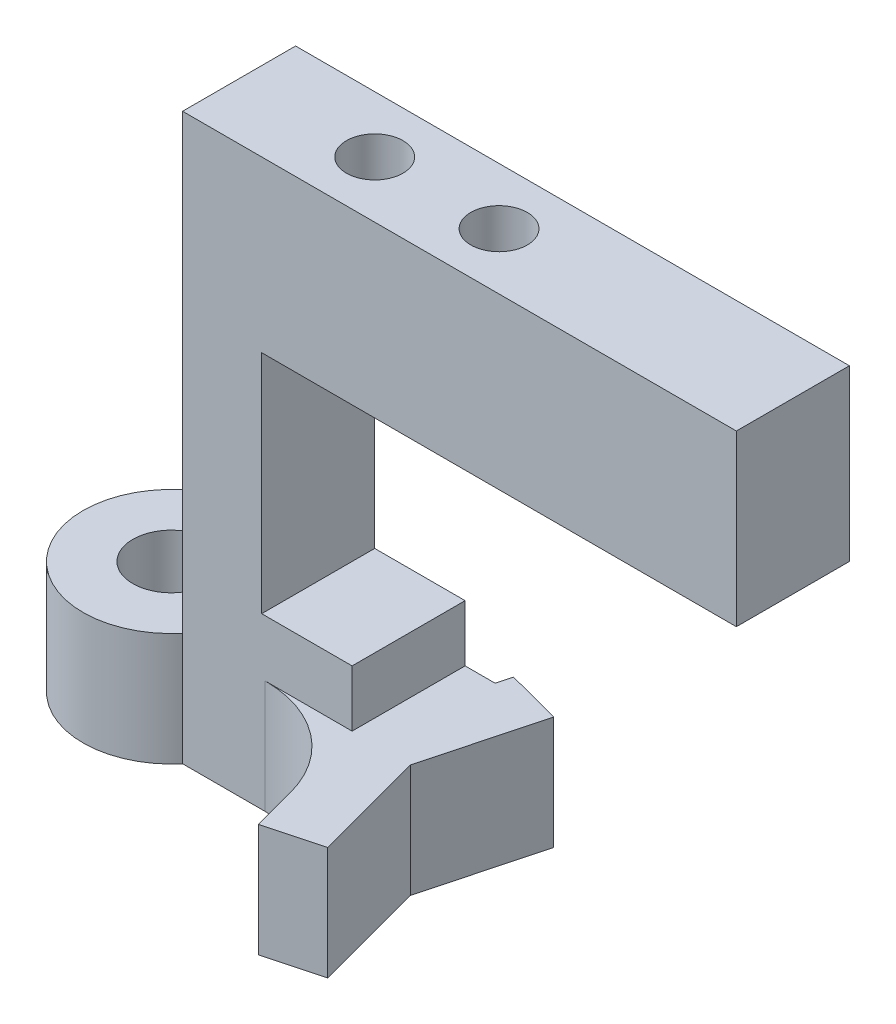
ISO-10303-21;
HEADER;
FILE_DESCRIPTION(('STEP AP214'),'2;1');
FILE_NAME('part.step','',(''),(''),'','','');
FILE_SCHEMA(('AUTOMOTIVE_DESIGN { 1 0 10303 214 1 1 1 1 }'));
ENDSEC;
DATA;
#1=APPLICATION_CONTEXT('core data for automotive mechanical design processes');
#2=APPLICATION_PROTOCOL_DEFINITION('international standard','automotive_design',2000,#1);
#3=PRODUCT_CONTEXT('',#1,'mechanical');
#4=PRODUCT('Part','Part','',(#3));
#5=PRODUCT_RELATED_PRODUCT_CATEGORY('part','',(#4));
#6=PRODUCT_DEFINITION_FORMATION('','',#4);
#7=PRODUCT_DEFINITION_CONTEXT('part definition',#1,'design');
#8=PRODUCT_DEFINITION('design','',#6,#7);
#9=PRODUCT_DEFINITION_SHAPE('','',#8);
#10=(LENGTH_UNIT() NAMED_UNIT(*) SI_UNIT(.MILLI.,.METRE.));
#11=(NAMED_UNIT(*) PLANE_ANGLE_UNIT() SI_UNIT($,.RADIAN.));
#12=(NAMED_UNIT(*) SI_UNIT($,.STERADIAN.) SOLID_ANGLE_UNIT());
#13=UNCERTAINTY_MEASURE_WITH_UNIT(LENGTH_MEASURE(1.E-05),#10,'distance_accuracy_value','');
#14=(GEOMETRIC_REPRESENTATION_CONTEXT(3) GLOBAL_UNCERTAINTY_ASSIGNED_CONTEXT((#13)) GLOBAL_UNIT_ASSIGNED_CONTEXT((#10,
#11,#12)) REPRESENTATION_CONTEXT('',''));
#15=CARTESIAN_POINT('',(0.,0.,0.));
#16=DIRECTION('',(0.,0.,1.));
#17=DIRECTION('',(1.,0.,0.));
#18=AXIS2_PLACEMENT_3D('',#15,#16,#17);
#19=CARTESIAN_POINT('',(0.,0.,5.));
#20=DIRECTION('',(1.,0.,0.));
#21=DIRECTION('',(0.,1.,0.));
#22=AXIS2_PLACEMENT_3D('',#19,#20,#21);
#23=PLANE('',#22);
#24=DIRECTION('',(0.,0.,1.));
#25=VECTOR('',#24,1.);
#26=CARTESIAN_POINT('',(0.,-40.,5.));
#27=LINE('',#26,#25);
#28=CARTESIAN_POINT('',(0.,-40.,-5.));
#29=VERTEX_POINT('',#28);
#30=CARTESIAN_POINT('',(0.,-40.,5.));
#31=VERTEX_POINT('',#30);
#32=EDGE_CURVE('E54',#29,#31,#27,.T.);
#33=ORIENTED_EDGE('',*,*,#32,.T.);
#34=DIRECTION('',(0.,-1.,0.));
#35=VECTOR('',#34,1.);
#36=CARTESIAN_POINT('',(0.,0.,5.));
#37=LINE('',#36,#35);
#38=CARTESIAN_POINT('',(0.,0.,5.));
#39=VERTEX_POINT('',#38);
#40=EDGE_CURVE('E276',#39,#31,#37,.T.);
#41=ORIENTED_EDGE('',*,*,#40,.F.);
#42=DIRECTION('',(0.,0.,-1.));
#43=VECTOR('',#42,1.);
#44=CARTESIAN_POINT('',(0.,0.,5.));
#45=LINE('',#44,#43);
#46=CARTESIAN_POINT('',(0.,0.,-5.));
#47=VERTEX_POINT('',#46);
#48=EDGE_CURVE('E295',#39,#47,#45,.T.);
#49=ORIENTED_EDGE('',*,*,#48,.T.);
#50=DIRECTION('',(0.,-1.,0.));
#51=VECTOR('',#50,1.);
#52=CARTESIAN_POINT('',(0.,0.,-5.));
#53=LINE('',#52,#51);
#54=EDGE_CURVE('E167',#47,#29,#53,.T.);
#55=ORIENTED_EDGE('',*,*,#54,.T.);
#56=EDGE_LOOP('',(#33,#41,#49,#55));
#57=FACE_BOUND('',#56,.T.);
#58=ADVANCED_FACE('F39',(#57),#23,.F.);
#59=CARTESIAN_POINT('',(15.,-50.,5.));
#60=DIRECTION('',(-1.,0.,0.));
#61=DIRECTION('',(0.,0.,1.));
#62=AXIS2_PLACEMENT_3D('',#59,#60,#61);
#63=PLANE('',#62);
#64=DIRECTION('',(0.,1.,0.));
#65=VECTOR('',#64,1.);
#66=CARTESIAN_POINT('',(15.,-50.,-5.));
#67=LINE('',#66,#65);
#68=CARTESIAN_POINT('',(15.,-40.,-5.));
#69=VERTEX_POINT('',#68);
#70=CARTESIAN_POINT('',(15.,-35.,-5.));
#71=VERTEX_POINT('',#70);
#72=EDGE_CURVE('E166',#69,#71,#67,.T.);
#73=ORIENTED_EDGE('',*,*,#72,.T.);
#74=DIRECTION('',(0.,0.,-1.));
#75=VECTOR('',#74,1.);
#76=CARTESIAN_POINT('',(15.,-35.,16.2846219164363));
#77=LINE('',#76,#75);
#78=CARTESIAN_POINT('',(15.,-35.,5.));
#79=VERTEX_POINT('',#78);
#80=EDGE_CURVE('E211',#79,#71,#77,.T.);
#81=ORIENTED_EDGE('',*,*,#80,.F.);
#82=DIRECTION('',(0.,1.,0.));
#83=VECTOR('',#82,1.);
#84=CARTESIAN_POINT('',(15.,-50.,5.));
#85=LINE('',#84,#83);
#86=CARTESIAN_POINT('',(15.,-40.,5.));
#87=VERTEX_POINT('',#86);
#88=EDGE_CURVE('E279',#87,#79,#85,.T.);
#89=ORIENTED_EDGE('',*,*,#88,.F.);
#90=DIRECTION('',(0.,0.,1.));
#91=VECTOR('',#90,1.);
#92=CARTESIAN_POINT('',(15.,-40.,0.));
#93=LINE('',#92,#91);
#94=EDGE_CURVE('E233',#69,#87,#93,.T.);
#95=ORIENTED_EDGE('',*,*,#94,.F.);
#96=EDGE_LOOP('',(#73,#81,#89,#95));
#97=FACE_BOUND('',#96,.T.);
#98=ADVANCED_FACE('F339',(#97),#63,.F.);
#99=CARTESIAN_POINT('',(49.,-15.,5.));
#100=DIRECTION('',(-1.,0.,0.));
#101=DIRECTION('',(0.,0.,1.));
#102=AXIS2_PLACEMENT_3D('',#99,#100,#101);
#103=PLANE('',#102);
#104=DIRECTION('',(0.,1.,0.));
#105=VECTOR('',#104,1.);
#106=CARTESIAN_POINT('',(49.,-15.,-5.));
#107=LINE('',#106,#105);
#108=CARTESIAN_POINT('',(49.,-15.,-5.));
#109=VERTEX_POINT('',#108);
#110=CARTESIAN_POINT('',(49.,0.,-5.));
#111=VERTEX_POINT('',#110);
#112=EDGE_CURVE('E257',#109,#111,#107,.T.);
#113=ORIENTED_EDGE('',*,*,#112,.T.);
#114=DIRECTION('',(0.,0.,-1.));
#115=VECTOR('',#114,1.);
#116=CARTESIAN_POINT('',(49.,0.,5.));
#117=LINE('',#116,#115);
#118=CARTESIAN_POINT('',(49.,0.,5.));
#119=VERTEX_POINT('',#118);
#120=EDGE_CURVE('E298',#119,#111,#117,.T.);
#121=ORIENTED_EDGE('',*,*,#120,.F.);
#122=DIRECTION('',(0.,1.,0.));
#123=VECTOR('',#122,1.);
#124=CARTESIAN_POINT('',(49.,-15.,5.));
#125=LINE('',#124,#123);
#126=CARTESIAN_POINT('',(49.,-15.,5.));
#127=VERTEX_POINT('',#126);
#128=EDGE_CURVE('E270',#127,#119,#125,.T.);
#129=ORIENTED_EDGE('',*,*,#128,.F.);
#130=DIRECTION('',(0.,0.,-1.));
#131=VECTOR('',#130,1.);
#132=CARTESIAN_POINT('',(49.,-15.,5.));
#133=LINE('',#132,#131);
#134=EDGE_CURVE('E284',#127,#109,#133,.T.);
#135=ORIENTED_EDGE('',*,*,#134,.T.);
#136=EDGE_LOOP('',(#113,#121,#129,#135));
#137=FACE_BOUND('',#136,.T.);
#138=ADVANCED_FACE('F346',(#137),#103,.F.);
#139=CARTESIAN_POINT('',(49.,0.,5.));
#140=DIRECTION('',(0.,-1.,0.));
#141=DIRECTION('',(1.,0.,0.));
#142=AXIS2_PLACEMENT_3D('',#139,#140,#141);
#143=PLANE('',#142);
#144=CARTESIAN_POINT('',(23.,0.,0.));
#145=DIRECTION('',(0.,-1.,0.));
#146=DIRECTION('',(0.,0.,-1.));
#147=AXIS2_PLACEMENT_3D('',#144,#145,#146);
#148=CIRCLE('',#147,2.5);
#149=CARTESIAN_POINT('',(23.,0.,-2.5));
#150=VERTEX_POINT('',#149);
#151=EDGE_CURVE('E194',#150,#150,#148,.T.);
#152=ORIENTED_EDGE('',*,*,#151,.T.);
#153=EDGE_LOOP('',(#152));
#154=FACE_BOUND('',#153,.T.);
#155=CARTESIAN_POINT('',(12.,0.,0.));
#156=DIRECTION('',(0.,-1.,0.));
#157=DIRECTION('',(0.,0.,-1.));
#158=AXIS2_PLACEMENT_3D('',#155,#156,#157);
#159=CIRCLE('',#158,2.5);
#160=CARTESIAN_POINT('',(12.,0.,-2.5));
#161=VERTEX_POINT('',#160);
#162=EDGE_CURVE('E192',#161,#161,#159,.T.);
#163=ORIENTED_EDGE('',*,*,#162,.T.);
#164=EDGE_LOOP('',(#163));
#165=FACE_BOUND('',#164,.T.);
#166=DIRECTION('',(-1.,0.,0.));
#167=VECTOR('',#166,1.);
#168=CARTESIAN_POINT('',(49.,0.,-5.));
#169=LINE('',#168,#167);
#170=EDGE_CURVE('E287',#111,#47,#169,.T.);
#171=ORIENTED_EDGE('',*,*,#170,.T.);
#172=ORIENTED_EDGE('',*,*,#48,.F.);
#173=DIRECTION('',(-1.,0.,0.));
#174=VECTOR('',#173,1.);
#175=CARTESIAN_POINT('',(49.,0.,5.));
#176=LINE('',#175,#174);
#177=EDGE_CURVE('E273',#119,#39,#176,.T.);
#178=ORIENTED_EDGE('',*,*,#177,.F.);
#179=ORIENTED_EDGE('',*,*,#120,.T.);
#180=EDGE_LOOP('',(#171,#172,#178,#179));
#181=FACE_BOUND('',#180,.T.);
#182=ADVANCED_FACE('F351',(#154,#165,#181),#143,.F.);
#183=CARTESIAN_POINT('',(0.,-50.,5.));
#184=DIRECTION('',(0.,1.,0.));
#185=DIRECTION('',(0.,0.,1.));
#186=AXIS2_PLACEMENT_3D('',#183,#184,#185);
#187=PLANE('',#186);
#188=DIRECTION('',(1.,0.,0.));
#189=VECTOR('',#188,1.);
#190=CARTESIAN_POINT('',(0.,-50.,-5.));
#191=LINE('',#190,#189);
#192=CARTESIAN_POINT('',(0.,-50.,-5.));
#193=VERTEX_POINT('',#192);
#194=CARTESIAN_POINT('',(17.658485168768,-50.,-5.00000000000001));
#195=VERTEX_POINT('',#194);
#196=EDGE_CURVE('E157',#193,#195,#191,.T.);
#197=ORIENTED_EDGE('',*,*,#196,.T.);
#198=DIRECTION('',(-0.256924383287255,0.,0.966431508836743));
#199=VECTOR('',#198,1.);
#200=CARTESIAN_POINT('',(15.2513470160732,-50.,4.05454798459645));
#201=LINE('',#200,#199);
#202=CARTESIAN_POINT('',(18.,-50.,-6.28462191643627));
#203=VERTEX_POINT('',#202);
#204=EDGE_CURVE('E251',#203,#195,#201,.T.);
#205=ORIENTED_EDGE('',*,*,#204,.F.);
#206=DIRECTION('',(-0.966431508836743,0.,-0.256924383287255));
#207=VECTOR('',#206,1.);
#208=CARTESIAN_POINT('',(2.74865298392679,-50.,-10.3391699010327));
#209=LINE('',#208,#207);
#210=CARTESIAN_POINT('',(22.8321575441837,-50.,-5.));
#211=VERTEX_POINT('',#210);
#212=EDGE_CURVE('E227',#211,#203,#209,.T.);
#213=ORIENTED_EDGE('',*,*,#212,.F.);
#214=DIRECTION('',(0.256924383287255,0.,-0.966431508836743));
#215=VECTOR('',#214,1.);
#216=CARTESIAN_POINT('',(20.0835045602569,-50.,5.33916990103273));
#217=LINE('',#216,#215);
#218=CARTESIAN_POINT('',(20.1736723754157,-50.,5.));
#219=VERTEX_POINT('',#218);
#220=EDGE_CURVE('E222',#219,#211,#217,.T.);
#221=ORIENTED_EDGE('',*,*,#220,.F.);
#222=DIRECTION('',(-0.256924383287254,0.,-0.966431508836743));
#223=VECTOR('',#222,1.);
#224=CARTESIAN_POINT('',(17.6005063662844,-50.,-4.67906851375735));
#225=LINE('',#224,#223);
#226=CARTESIAN_POINT('',(22.8321575441837,-50.,15.));
#227=VERTEX_POINT('',#226);
#228=EDGE_CURVE('E245',#227,#219,#225,.T.);
#229=ORIENTED_EDGE('',*,*,#228,.F.);
#230=DIRECTION('',(0.966431508836743,0.,-0.256924383287254));
#231=VECTOR('',#230,1.);
#232=CARTESIAN_POINT('',(5.23165117789928,-50.,19.6790685137574));
#233=LINE('',#232,#231);
#234=CARTESIAN_POINT('',(18.,-50.,16.2846219164363));
#235=VERTEX_POINT('',#234);
#236=EDGE_CURVE('E247',#235,#227,#233,.T.);
#237=ORIENTED_EDGE('',*,*,#236,.F.);
#238=DIRECTION('',(0.256924383287254,0.,0.966431508836743));
#239=VECTOR('',#238,1.);
#240=CARTESIAN_POINT('',(12.7683488221007,-50.,-3.39444659732108));
#241=LINE('',#240,#239);
#242=CARTESIAN_POINT('',(16.975455506304,-50.,12.4307561671275));
#243=VERTEX_POINT('',#242);
#244=EDGE_CURVE('E249',#243,#235,#241,.T.);
#245=ORIENTED_EDGE('',*,*,#244,.F.);
#246=CARTESIAN_POINT('',(7.31114041793653,-50.,15.));
#247=DIRECTION('',(0.,1.,0.));
#248=DIRECTION('',(0.,0.,1.));
#249=AXIS2_PLACEMENT_3D('',#246,#247,#248);
#250=CIRCLE('',#249,10.);
#251=CARTESIAN_POINT('',(7.31114041793653,-50.,5.));
#252=VERTEX_POINT('',#251);
#253=EDGE_CURVE('E11',#243,#252,#250,.T.);
#254=ORIENTED_EDGE('',*,*,#253,.T.);
#255=DIRECTION('',(1.,0.,0.));
#256=VECTOR('',#255,1.);
#257=CARTESIAN_POINT('',(0.,-50.,5.));
#258=LINE('',#257,#256);
#259=CARTESIAN_POINT('',(0.,-50.,5.));
#260=VERTEX_POINT('',#259);
#261=EDGE_CURVE('E183',#260,#252,#258,.T.);
#262=ORIENTED_EDGE('',*,*,#261,.F.);
#263=CARTESIAN_POINT('',(-6.,-50.,0.));
#264=DIRECTION('',(0.,-1.,0.));
#265=DIRECTION('',(0.,0.,-1.));
#266=AXIS2_PLACEMENT_3D('',#263,#264,#265);
#267=CIRCLE('',#266,7.81024967590665);
#268=EDGE_CURVE('E174',#260,#193,#267,.T.);
#269=ORIENTED_EDGE('',*,*,#268,.T.);
#270=EDGE_LOOP('',(#197,#205,#213,#221,#229,#237,#245,#254,#262,#269));
#271=FACE_BOUND('',#270,.T.);
#272=CARTESIAN_POINT('',(-6.,-50.,0.));
#273=DIRECTION('',(0.,-1.,0.));
#274=DIRECTION('',(0.,0.,-1.));
#275=AXIS2_PLACEMENT_3D('',#272,#273,#274);
#276=CIRCLE('',#275,3.4);
#277=CARTESIAN_POINT('',(-6.,-50.,-3.4));
#278=VERTEX_POINT('',#277);
#279=EDGE_CURVE('E188',#278,#278,#276,.T.);
#280=ORIENTED_EDGE('',*,*,#279,.F.);
#281=EDGE_LOOP('',(#280));
#282=FACE_BOUND('',#281,.T.);
#283=ADVANCED_FACE('F180',(#271,#282),#187,.F.);
#284=CARTESIAN_POINT('',(15.,-15.,5.));
#285=DIRECTION('',(0.,1.,0.));
#286=DIRECTION('',(0.,0.,1.));
#287=AXIS2_PLACEMENT_3D('',#284,#285,#286);
#288=PLANE('',#287);
#289=CARTESIAN_POINT('',(23.,-15.,0.));
#290=DIRECTION('',(0.,-1.,0.));
#291=DIRECTION('',(0.,0.,-1.));
#292=AXIS2_PLACEMENT_3D('',#289,#290,#291);
#293=CIRCLE('',#292,2.5);
#294=CARTESIAN_POINT('',(23.,-15.,-2.5));
#295=VERTEX_POINT('',#294);
#296=EDGE_CURVE('E198',#295,#295,#293,.T.);
#297=ORIENTED_EDGE('',*,*,#296,.F.);
#298=EDGE_LOOP('',(#297));
#299=FACE_BOUND('',#298,.T.);
#300=CARTESIAN_POINT('',(12.,-15.,0.));
#301=DIRECTION('',(0.,-1.,0.));
#302=DIRECTION('',(0.,0.,-1.));
#303=AXIS2_PLACEMENT_3D('',#300,#301,#302);
#304=CIRCLE('',#303,2.5);
#305=CARTESIAN_POINT('',(12.,-15.,-2.5));
#306=VERTEX_POINT('',#305);
#307=EDGE_CURVE('E201',#306,#306,#304,.T.);
#308=ORIENTED_EDGE('',*,*,#307,.F.);
#309=EDGE_LOOP('',(#308));
#310=FACE_BOUND('',#309,.T.);
#311=DIRECTION('',(1.,0.,0.));
#312=VECTOR('',#311,1.);
#313=CARTESIAN_POINT('',(15.,-15.,-5.));
#314=LINE('',#313,#312);
#315=CARTESIAN_POINT('',(7.,-15.,-5.));
#316=VERTEX_POINT('',#315);
#317=EDGE_CURVE('E274',#316,#109,#314,.T.);
#318=ORIENTED_EDGE('',*,*,#317,.T.);
#319=ORIENTED_EDGE('',*,*,#134,.F.);
#320=DIRECTION('',(1.,0.,0.));
#321=VECTOR('',#320,1.);
#322=CARTESIAN_POINT('',(15.,-15.,5.));
#323=LINE('',#322,#321);
#324=CARTESIAN_POINT('',(7.,-15.,5.));
#325=VERTEX_POINT('',#324);
#326=EDGE_CURVE('E282',#325,#127,#323,.T.);
#327=ORIENTED_EDGE('',*,*,#326,.F.);
#328=DIRECTION('',(0.,0.,-1.));
#329=VECTOR('',#328,1.);
#330=CARTESIAN_POINT('',(7.,-15.,16.2846219164363));
#331=LINE('',#330,#329);
#332=EDGE_CURVE('E212',#325,#316,#331,.T.);
#333=ORIENTED_EDGE('',*,*,#332,.T.);
#334=EDGE_LOOP('',(#318,#319,#327,#333));
#335=FACE_BOUND('',#334,.T.);
#336=ADVANCED_FACE('F368',(#299,#310,#335),#288,.F.);
#337=CARTESIAN_POINT('',(0.,0.,5.));
#338=DIRECTION('',(0.,0.,1.));
#339=DIRECTION('',(1.,0.,0.));
#340=AXIS2_PLACEMENT_3D('',#337,#338,#339);
#341=PLANE('',#340);
#342=DIRECTION('',(0.,-1.,0.));
#343=VECTOR('',#342,1.);
#344=CARTESIAN_POINT('',(7.,0.,5.));
#345=LINE('',#344,#343);
#346=CARTESIAN_POINT('',(7.,-35.,5.));
#347=VERTEX_POINT('',#346);
#348=EDGE_CURVE('E220',#325,#347,#345,.T.);
#349=ORIENTED_EDGE('',*,*,#348,.F.);
#350=ORIENTED_EDGE('',*,*,#326,.T.);
#351=ORIENTED_EDGE('',*,*,#128,.T.);
#352=ORIENTED_EDGE('',*,*,#177,.T.);
#353=ORIENTED_EDGE('',*,*,#40,.T.);
#354=DIRECTION('',(0.,-1.,0.));
#355=VECTOR('',#354,1.);
#356=CARTESIAN_POINT('',(0.,-40.,5.));
#357=LINE('',#356,#355);
#358=EDGE_CURVE('E177',#31,#260,#357,.T.);
#359=ORIENTED_EDGE('',*,*,#358,.T.);
#360=ORIENTED_EDGE('',*,*,#261,.T.);
#361=DIRECTION('',(0.,1.,0.));
#362=VECTOR('',#361,1.);
#363=CARTESIAN_POINT('',(7.31114041793653,0.,5.));
#364=LINE('',#363,#362);
#365=CARTESIAN_POINT('',(7.31114041793653,-40.,5.));
#366=VERTEX_POINT('',#365);
#367=EDGE_CURVE('E303',#252,#366,#364,.T.);
#368=ORIENTED_EDGE('',*,*,#367,.T.);
#369=DIRECTION('',(1.,0.,0.));
#370=VECTOR('',#369,1.);
#371=CARTESIAN_POINT('',(0.,-40.,5.));
#372=LINE('',#371,#370);
#373=EDGE_CURVE('E301',#366,#87,#372,.T.);
#374=ORIENTED_EDGE('',*,*,#373,.T.);
#375=ORIENTED_EDGE('',*,*,#88,.T.);
#376=DIRECTION('',(1.,0.,0.));
#377=VECTOR('',#376,1.);
#378=CARTESIAN_POINT('',(0.,-35.,5.));
#379=LINE('',#378,#377);
#380=EDGE_CURVE('E215',#347,#79,#379,.T.);
#381=ORIENTED_EDGE('',*,*,#380,.F.);
#382=EDGE_LOOP('',(#349,#350,#351,#352,#353,#359,#360,#368,#374,#375,#381));
#383=FACE_BOUND('',#382,.T.);
#384=ADVANCED_FACE('F323',(#383),#341,.T.);
#385=CARTESIAN_POINT('',(0.,0.,-5.));
#386=DIRECTION('',(0.,0.,1.));
#387=DIRECTION('',(1.,0.,0.));
#388=AXIS2_PLACEMENT_3D('',#385,#386,#387);
#389=PLANE('',#388);
#390=ORIENTED_EDGE('',*,*,#317,.F.);
#391=DIRECTION('',(0.,1.,0.));
#392=VECTOR('',#391,1.);
#393=CARTESIAN_POINT('',(7.,-15.,-5.));
#394=LINE('',#393,#392);
#395=CARTESIAN_POINT('',(7.,-35.,-5.));
#396=VERTEX_POINT('',#395);
#397=EDGE_CURVE('E208',#396,#316,#394,.T.);
#398=ORIENTED_EDGE('',*,*,#397,.F.);
#399=DIRECTION('',(-1.,0.,0.));
#400=VECTOR('',#399,1.);
#401=CARTESIAN_POINT('',(15.,-35.,-5.));
#402=LINE('',#401,#400);
#403=EDGE_CURVE('E197',#71,#396,#402,.T.);
#404=ORIENTED_EDGE('',*,*,#403,.F.);
#405=ORIENTED_EDGE('',*,*,#72,.F.);
#406=DIRECTION('',(1.,0.,0.));
#407=VECTOR('',#406,1.);
#408=CARTESIAN_POINT('',(0.,-40.,-5.));
#409=LINE('',#408,#407);
#410=CARTESIAN_POINT('',(17.658485168768,-40.,-5.00000000000001));
#411=VERTEX_POINT('',#410);
#412=EDGE_CURVE('E236',#69,#411,#409,.T.);
#413=ORIENTED_EDGE('',*,*,#412,.T.);
#414=DIRECTION('',(0.,-1.,0.));
#415=VECTOR('',#414,1.);
#416=CARTESIAN_POINT('',(17.658485168768,-40.,-5.00000000000001));
#417=LINE('',#416,#415);
#418=EDGE_CURVE('E161',#411,#195,#417,.T.);
#419=ORIENTED_EDGE('',*,*,#418,.T.);
#420=ORIENTED_EDGE('',*,*,#196,.F.);
#421=DIRECTION('',(0.,-1.,0.));
#422=VECTOR('',#421,1.);
#423=CARTESIAN_POINT('',(0.,-40.,-5.));
#424=LINE('',#423,#422);
#425=EDGE_CURVE('E62',#29,#193,#424,.T.);
#426=ORIENTED_EDGE('',*,*,#425,.F.);
#427=ORIENTED_EDGE('',*,*,#54,.F.);
#428=ORIENTED_EDGE('',*,*,#170,.F.);
#429=ORIENTED_EDGE('',*,*,#112,.F.);
#430=EDGE_LOOP('',(#390,#398,#404,#405,#413,#419,#420,#426,#427,#428,#429));
#431=FACE_BOUND('',#430,.T.);
#432=ADVANCED_FACE('F158',(#431),#389,.F.);
#433=CARTESIAN_POINT('',(20.0835045602569,-40.,5.33916990103273));
#434=DIRECTION('',(-0.966431508836743,0.,-0.256924383287255));
#435=DIRECTION('',(-0.256924383287255,0.,0.966431508836743));
#436=AXIS2_PLACEMENT_3D('',#433,#434,#435);
#437=PLANE('',#436);
#438=ORIENTED_EDGE('',*,*,#220,.T.);
#439=DIRECTION('',(0.,-1.,0.));
#440=VECTOR('',#439,1.);
#441=CARTESIAN_POINT('',(22.8321575441837,-40.,-5.));
#442=LINE('',#441,#440);
#443=CARTESIAN_POINT('',(22.8321575441837,-40.,-5.));
#444=VERTEX_POINT('',#443);
#445=EDGE_CURVE('E254',#444,#211,#442,.T.);
#446=ORIENTED_EDGE('',*,*,#445,.F.);
#447=DIRECTION('',(0.256924383287255,0.,-0.966431508836743));
#448=VECTOR('',#447,1.);
#449=CARTESIAN_POINT('',(20.0835045602569,-40.,5.33916990103273));
#450=LINE('',#449,#448);
#451=CARTESIAN_POINT('',(20.1736723754157,-40.,5.));
#452=VERTEX_POINT('',#451);
#453=EDGE_CURVE('E223',#452,#444,#450,.T.);
#454=ORIENTED_EDGE('',*,*,#453,.F.);
#455=DIRECTION('',(0.,-1.,0.));
#456=VECTOR('',#455,1.);
#457=CARTESIAN_POINT('',(20.1736723754157,-40.,5.));
#458=LINE('',#457,#456);
#459=EDGE_CURVE('E242',#452,#219,#458,.T.);
#460=ORIENTED_EDGE('',*,*,#459,.T.);
#461=EDGE_LOOP('',(#438,#446,#454,#460));
#462=FACE_BOUND('',#461,.T.);
#463=ADVANCED_FACE('F389',(#462),#437,.F.);
#464=CARTESIAN_POINT('',(2.74865298392679,-40.,-10.3391699010327));
#465=DIRECTION('',(-0.256924383287255,0.,0.966431508836743));
#466=DIRECTION('',(0.966431508836743,0.,0.256924383287255));
#467=AXIS2_PLACEMENT_3D('',#464,#465,#466);
#468=PLANE('',#467);
#469=ORIENTED_EDGE('',*,*,#212,.T.);
#470=DIRECTION('',(0.,-1.,0.));
#471=VECTOR('',#470,1.);
#472=CARTESIAN_POINT('',(18.,-40.,-6.28462191643627));
#473=LINE('',#472,#471);
#474=CARTESIAN_POINT('',(18.,-40.,-6.28462191643627));
#475=VERTEX_POINT('',#474);
#476=EDGE_CURVE('E258',#475,#203,#473,.T.);
#477=ORIENTED_EDGE('',*,*,#476,.F.);
#478=DIRECTION('',(-0.966431508836743,0.,-0.256924383287255));
#479=VECTOR('',#478,1.);
#480=CARTESIAN_POINT('',(2.74865298392679,-40.,-10.3391699010327));
#481=LINE('',#480,#479);
#482=EDGE_CURVE('E240',#444,#475,#481,.T.);
#483=ORIENTED_EDGE('',*,*,#482,.F.);
#484=ORIENTED_EDGE('',*,*,#445,.T.);
#485=EDGE_LOOP('',(#469,#477,#483,#484));
#486=FACE_BOUND('',#485,.T.);
#487=ADVANCED_FACE('F386',(#486),#468,.F.);
#488=CARTESIAN_POINT('',(15.2513470160732,-40.,4.05454798459645));
#489=DIRECTION('',(0.966431508836743,0.,0.256924383287255));
#490=DIRECTION('',(0.256924383287255,0.,-0.966431508836743));
#491=AXIS2_PLACEMENT_3D('',#488,#489,#490);
#492=PLANE('',#491);
#493=ORIENTED_EDGE('',*,*,#204,.T.);
#494=ORIENTED_EDGE('',*,*,#418,.F.);
#495=DIRECTION('',(-0.256924383287255,0.,0.966431508836743));
#496=VECTOR('',#495,1.);
#497=CARTESIAN_POINT('',(15.2513470160732,-40.,4.05454798459645));
#498=LINE('',#497,#496);
#499=EDGE_CURVE('E238',#475,#411,#498,.T.);
#500=ORIENTED_EDGE('',*,*,#499,.F.);
#501=ORIENTED_EDGE('',*,*,#476,.T.);
#502=EDGE_LOOP('',(#493,#494,#500,#501));
#503=FACE_BOUND('',#502,.T.);
#504=ADVANCED_FACE('F381',(#503),#492,.F.);
#505=CARTESIAN_POINT('',(12.7683488221007,-40.,-3.39444659732108));
#506=DIRECTION('',(0.966431508836743,0.,-0.256924383287254));
#507=DIRECTION('',(-0.256924383287254,0.,-0.966431508836743));
#508=AXIS2_PLACEMENT_3D('',#505,#506,#507);
#509=PLANE('',#508);
#510=DIRECTION('',(0.256924383287254,0.,0.966431508836743));
#511=VECTOR('',#510,1.);
#512=CARTESIAN_POINT('',(12.7683488221007,-40.,-3.39444659732108));
#513=LINE('',#512,#511);
#514=CARTESIAN_POINT('',(16.975455506304,-40.,12.4307561671275));
#515=VERTEX_POINT('',#514);
#516=CARTESIAN_POINT('',(18.,-40.,16.2846219164363));
#517=VERTEX_POINT('',#516);
#518=EDGE_CURVE('E231',#515,#517,#513,.T.);
#519=ORIENTED_EDGE('',*,*,#518,.F.);
#520=DIRECTION('',(0.,1.,0.));
#521=VECTOR('',#520,1.);
#522=CARTESIAN_POINT('',(16.975455506304,-40.,12.4307561671275));
#523=LINE('',#522,#521);
#524=EDGE_CURVE('E306',#515,#243,#523,.F.);
#525=ORIENTED_EDGE('',*,*,#524,.T.);
#526=ORIENTED_EDGE('',*,*,#244,.T.);
#527=DIRECTION('',(0.,-1.,0.));
#528=VECTOR('',#527,1.);
#529=CARTESIAN_POINT('',(18.,-40.,16.2846219164363));
#530=LINE('',#529,#528);
#531=EDGE_CURVE('E262',#517,#235,#530,.T.);
#532=ORIENTED_EDGE('',*,*,#531,.F.);
#533=EDGE_LOOP('',(#519,#525,#526,#532));
#534=FACE_BOUND('',#533,.T.);
#535=ADVANCED_FACE('F316',(#534),#509,.F.);
#536=CARTESIAN_POINT('',(5.23165117789928,-40.,19.6790685137574));
#537=DIRECTION('',(-0.256924383287254,0.,-0.966431508836743));
#538=DIRECTION('',(-0.966431508836743,0.,0.256924383287254));
#539=AXIS2_PLACEMENT_3D('',#536,#537,#538);
#540=PLANE('',#539);
#541=ORIENTED_EDGE('',*,*,#236,.T.);
#542=DIRECTION('',(0.,-1.,0.));
#543=VECTOR('',#542,1.);
#544=CARTESIAN_POINT('',(22.8321575441837,-40.,15.));
#545=LINE('',#544,#543);
#546=CARTESIAN_POINT('',(22.8321575441837,-40.,15.));
#547=VERTEX_POINT('',#546);
#548=EDGE_CURVE('E265',#547,#227,#545,.T.);
#549=ORIENTED_EDGE('',*,*,#548,.F.);
#550=DIRECTION('',(0.966431508836743,0.,-0.256924383287254));
#551=VECTOR('',#550,1.);
#552=CARTESIAN_POINT('',(5.23165117789928,-40.,19.6790685137574));
#553=LINE('',#552,#551);
#554=EDGE_CURVE('E229',#517,#547,#553,.T.);
#555=ORIENTED_EDGE('',*,*,#554,.F.);
#556=ORIENTED_EDGE('',*,*,#531,.T.);
#557=EDGE_LOOP('',(#541,#549,#555,#556));
#558=FACE_BOUND('',#557,.T.);
#559=ADVANCED_FACE('F396',(#558),#540,.F.);
#560=CARTESIAN_POINT('',(17.6005063662844,-40.,-4.67906851375735));
#561=DIRECTION('',(-0.966431508836743,0.,0.256924383287254));
#562=DIRECTION('',(0.256924383287254,0.,0.966431508836743));
#563=AXIS2_PLACEMENT_3D('',#560,#561,#562);
#564=PLANE('',#563);
#565=ORIENTED_EDGE('',*,*,#228,.T.);
#566=ORIENTED_EDGE('',*,*,#459,.F.);
#567=DIRECTION('',(-0.256924383287254,0.,-0.966431508836743));
#568=VECTOR('',#567,1.);
#569=CARTESIAN_POINT('',(17.6005063662844,-40.,-4.67906851375735));
#570=LINE('',#569,#568);
#571=EDGE_CURVE('E226',#547,#452,#570,.T.);
#572=ORIENTED_EDGE('',*,*,#571,.F.);
#573=ORIENTED_EDGE('',*,*,#548,.T.);
#574=EDGE_LOOP('',(#565,#566,#572,#573));
#575=FACE_BOUND('',#574,.T.);
#576=ADVANCED_FACE('F393',(#575),#564,.F.);
#577=CARTESIAN_POINT('',(0.,-40.,0.));
#578=DIRECTION('',(0.,-1.,0.));
#579=DIRECTION('',(0.,0.,-1.));
#580=AXIS2_PLACEMENT_3D('',#577,#578,#579);
#581=PLANE('',#580);
#582=ORIENTED_EDGE('',*,*,#453,.T.);
#583=ORIENTED_EDGE('',*,*,#482,.T.);
#584=ORIENTED_EDGE('',*,*,#499,.T.);
#585=ORIENTED_EDGE('',*,*,#412,.F.);
#586=ORIENTED_EDGE('',*,*,#94,.T.);
#587=ORIENTED_EDGE('',*,*,#373,.F.);
#588=CARTESIAN_POINT('',(7.31114041793653,-40.,15.));
#589=DIRECTION('',(0.,-1.,0.));
#590=DIRECTION('',(0.,0.,-1.));
#591=AXIS2_PLACEMENT_3D('',#588,#589,#590);
#592=CIRCLE('',#591,10.);
#593=EDGE_CURVE('E47',#366,#515,#592,.T.);
#594=ORIENTED_EDGE('',*,*,#593,.T.);
#595=ORIENTED_EDGE('',*,*,#518,.T.);
#596=ORIENTED_EDGE('',*,*,#554,.T.);
#597=ORIENTED_EDGE('',*,*,#571,.T.);
#598=EDGE_LOOP('',(#582,#583,#584,#585,#586,#587,#594,#595,#596,#597));
#599=FACE_BOUND('',#598,.T.);
#600=ADVANCED_FACE('F310',(#599),#581,.F.);
#601=CARTESIAN_POINT('',(7.31114041793653,0.,15.));
#602=DIRECTION('',(0.,1.,0.));
#603=DIRECTION('',(0.,0.,1.));
#604=AXIS2_PLACEMENT_3D('',#601,#602,#603);
#605=CYLINDRICAL_SURFACE('',#604,10.);
#606=ORIENTED_EDGE('',*,*,#253,.F.);
#607=ORIENTED_EDGE('',*,*,#524,.F.);
#608=ORIENTED_EDGE('',*,*,#593,.F.);
#609=ORIENTED_EDGE('',*,*,#367,.F.);
#610=EDGE_LOOP('',(#606,#607,#608,#609));
#611=FACE_BOUND('',#610,.T.);
#612=ADVANCED_FACE('F41',(#611),#605,.F.);
#613=CARTESIAN_POINT('',(7.,-15.,16.2846219164363));
#614=DIRECTION('',(-1.,0.,0.));
#615=DIRECTION('',(0.,-1.,0.));
#616=AXIS2_PLACEMENT_3D('',#613,#614,#615);
#617=PLANE('',#616);
#618=ORIENTED_EDGE('',*,*,#348,.T.);
#619=DIRECTION('',(0.,0.,-1.));
#620=VECTOR('',#619,1.);
#621=CARTESIAN_POINT('',(7.,-35.,16.2846219164363));
#622=LINE('',#621,#620);
#623=EDGE_CURVE('E216',#347,#396,#622,.T.);
#624=ORIENTED_EDGE('',*,*,#623,.T.);
#625=ORIENTED_EDGE('',*,*,#397,.T.);
#626=ORIENTED_EDGE('',*,*,#332,.F.);
#627=EDGE_LOOP('',(#618,#624,#625,#626));
#628=FACE_BOUND('',#627,.T.);
#629=ADVANCED_FACE('F370',(#628),#617,.F.);
#630=CARTESIAN_POINT('',(15.,-35.,16.2846219164363));
#631=DIRECTION('',(0.,-1.,0.));
#632=DIRECTION('',(0.,0.,-1.));
#633=AXIS2_PLACEMENT_3D('',#630,#631,#632);
#634=PLANE('',#633);
#635=ORIENTED_EDGE('',*,*,#380,.T.);
#636=ORIENTED_EDGE('',*,*,#80,.T.);
#637=ORIENTED_EDGE('',*,*,#403,.T.);
#638=ORIENTED_EDGE('',*,*,#623,.F.);
#639=EDGE_LOOP('',(#635,#636,#637,#638));
#640=FACE_BOUND('',#639,.T.);
#641=ADVANCED_FACE('F425',(#640),#634,.F.);
#642=CARTESIAN_POINT('',(12.,0.,0.));
#643=DIRECTION('',(0.,-1.,0.));
#644=DIRECTION('',(0.,0.,-1.));
#645=AXIS2_PLACEMENT_3D('',#642,#643,#644);
#646=CYLINDRICAL_SURFACE('',#645,2.5);
#647=ORIENTED_EDGE('',*,*,#162,.F.);
#648=EDGE_LOOP('',(#647));
#649=FACE_BOUND('',#648,.T.);
#650=ORIENTED_EDGE('',*,*,#307,.T.);
#651=EDGE_LOOP('',(#650));
#652=FACE_BOUND('',#651,.T.);
#653=ADVANCED_FACE('F423',(#649,#652),#646,.F.);
#654=CARTESIAN_POINT('',(23.,0.,0.));
#655=DIRECTION('',(0.,-1.,0.));
#656=DIRECTION('',(0.,0.,-1.));
#657=AXIS2_PLACEMENT_3D('',#654,#655,#656);
#658=CYLINDRICAL_SURFACE('',#657,2.5);
#659=ORIENTED_EDGE('',*,*,#151,.F.);
#660=EDGE_LOOP('',(#659));
#661=FACE_BOUND('',#660,.T.);
#662=ORIENTED_EDGE('',*,*,#296,.T.);
#663=EDGE_LOOP('',(#662));
#664=FACE_BOUND('',#663,.T.);
#665=ADVANCED_FACE('F336',(#661,#664),#658,.F.);
#666=CARTESIAN_POINT('',(-6.,-40.,0.));
#667=DIRECTION('',(0.,-1.,0.));
#668=DIRECTION('',(0.,0.,-1.));
#669=AXIS2_PLACEMENT_3D('',#666,#667,#668);
#670=CYLINDRICAL_SURFACE('',#669,7.81024967590665);
#671=ORIENTED_EDGE('',*,*,#268,.F.);
#672=ORIENTED_EDGE('',*,*,#358,.F.);
#673=CARTESIAN_POINT('',(-6.,-40.,0.));
#674=DIRECTION('',(0.,-1.,0.));
#675=DIRECTION('',(0.,0.,-1.));
#676=AXIS2_PLACEMENT_3D('',#673,#674,#675);
#677=CIRCLE('',#676,7.81024967590665);
#678=EDGE_CURVE('E176',#31,#29,#677,.T.);
#679=ORIENTED_EDGE('',*,*,#678,.T.);
#680=ORIENTED_EDGE('',*,*,#425,.T.);
#681=EDGE_LOOP('',(#671,#672,#679,#680));
#682=FACE_BOUND('',#681,.T.);
#683=ADVANCED_FACE('F172',(#682),#670,.T.);
#684=CARTESIAN_POINT('',(-6.,-40.,0.));
#685=DIRECTION('',(0.,-1.,0.));
#686=DIRECTION('',(0.,0.,-1.));
#687=AXIS2_PLACEMENT_3D('',#684,#685,#686);
#688=PLANE('',#687);
#689=CARTESIAN_POINT('',(-6.,-40.,0.));
#690=DIRECTION('',(0.,-1.,0.));
#691=DIRECTION('',(0.,0.,-1.));
#692=AXIS2_PLACEMENT_3D('',#689,#690,#691);
#693=CIRCLE('',#692,3.4);
#694=CARTESIAN_POINT('',(-6.,-40.,-3.4));
#695=VERTEX_POINT('',#694);
#696=EDGE_CURVE('E184',#695,#695,#693,.T.);
#697=ORIENTED_EDGE('',*,*,#696,.T.);
#698=EDGE_LOOP('',(#697));
#699=FACE_BOUND('',#698,.T.);
#700=ORIENTED_EDGE('',*,*,#678,.F.);
#701=ORIENTED_EDGE('',*,*,#32,.F.);
#702=EDGE_LOOP('',(#700,#701));
#703=FACE_BOUND('',#702,.T.);
#704=ADVANCED_FACE('F325',(#699,#703),#688,.F.);
#705=CARTESIAN_POINT('',(-6.,-40.,0.));
#706=DIRECTION('',(0.,-1.,0.));
#707=DIRECTION('',(0.,0.,-1.));
#708=AXIS2_PLACEMENT_3D('',#705,#706,#707);
#709=CYLINDRICAL_SURFACE('',#708,3.4);
#710=ORIENTED_EDGE('',*,*,#696,.F.);
#711=EDGE_LOOP('',(#710));
#712=FACE_BOUND('',#711,.T.);
#713=ORIENTED_EDGE('',*,*,#279,.T.);
#714=EDGE_LOOP('',(#713));
#715=FACE_BOUND('',#714,.T.);
#716=ADVANCED_FACE('F327',(#712,#715),#709,.F.);
#717=CLOSED_SHELL('',(#58,#98,#138,#182,#283,#336,#384,#432,#463,#487,#504,#535,#559,#576,#600,
#612,#629,#641,#653,#665,#683,#704,#716));
#718=MANIFOLD_SOLID_BREP('B2',#717);
#719=ADVANCED_BREP_SHAPE_REPRESENTATION('',(#18,#718),#14);
#720=SHAPE_DEFINITION_REPRESENTATION(#9,#719);
ENDSEC;
END-ISO-10303-21;
